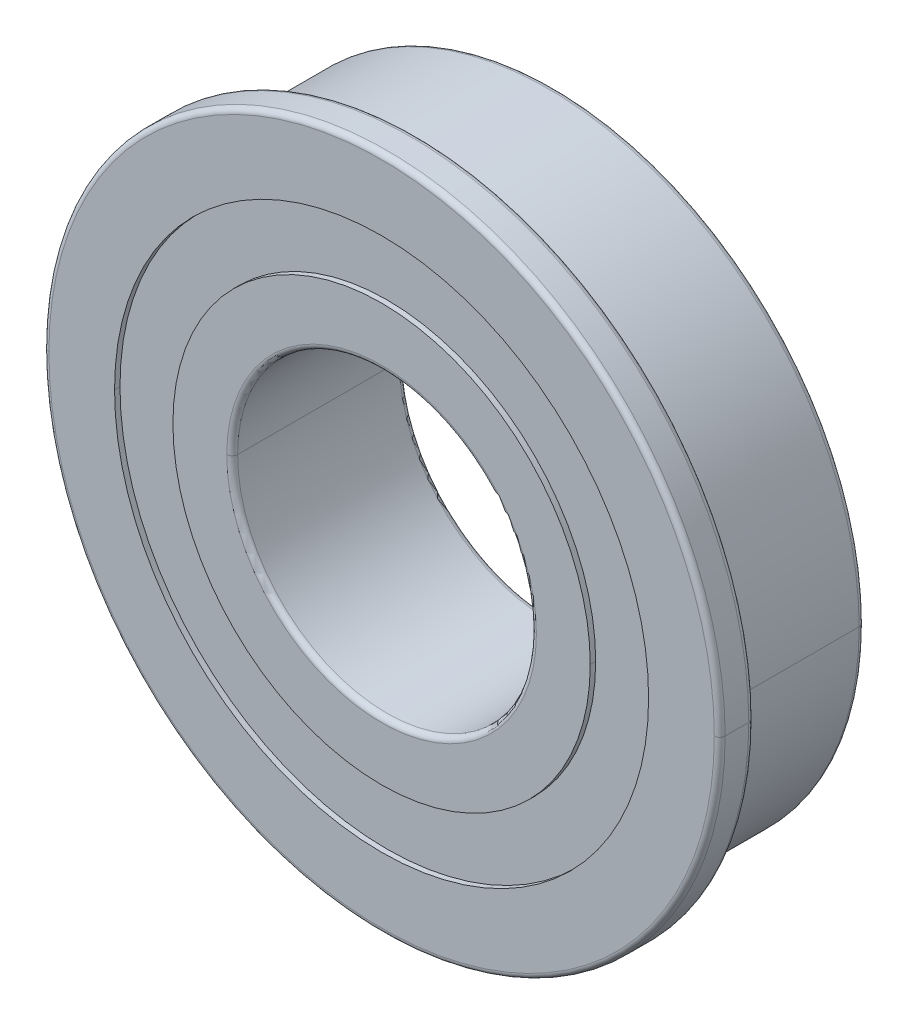
ISO-10303-21;
HEADER;
FILE_DESCRIPTION(('STEP AP214'),'2;1');
FILE_NAME('part.step','',(''),(''),'','','');
FILE_SCHEMA(('AUTOMOTIVE_DESIGN { 1 0 10303 214 1 1 1 1 }'));
ENDSEC;
DATA;
#1=APPLICATION_CONTEXT('core data for automotive mechanical design processes');
#2=APPLICATION_PROTOCOL_DEFINITION('international standard','automotive_design',2000,#1);
#3=PRODUCT_CONTEXT('',#1,'mechanical');
#4=PRODUCT('Part','Part','',(#3));
#5=PRODUCT_RELATED_PRODUCT_CATEGORY('part','',(#4));
#6=PRODUCT_DEFINITION_FORMATION('','',#4);
#7=PRODUCT_DEFINITION_CONTEXT('part definition',#1,'design');
#8=PRODUCT_DEFINITION('design','',#6,#7);
#9=PRODUCT_DEFINITION_SHAPE('','',#8);
#10=(LENGTH_UNIT() NAMED_UNIT(*) SI_UNIT(.MILLI.,.METRE.));
#11=(NAMED_UNIT(*) PLANE_ANGLE_UNIT() SI_UNIT($,.RADIAN.));
#12=(NAMED_UNIT(*) SI_UNIT($,.STERADIAN.) SOLID_ANGLE_UNIT());
#13=UNCERTAINTY_MEASURE_WITH_UNIT(LENGTH_MEASURE(1.E-05),#10,'distance_accuracy_value','');
#14=(GEOMETRIC_REPRESENTATION_CONTEXT(3) GLOBAL_UNCERTAINTY_ASSIGNED_CONTEXT((#13)) GLOBAL_UNIT_ASSIGNED_CONTEXT((#10,
#11,#12)) REPRESENTATION_CONTEXT('',''));
#15=CARTESIAN_POINT('',(0.,0.,0.));
#16=DIRECTION('',(0.,0.,1.));
#17=DIRECTION('',(1.,0.,0.));
#18=AXIS2_PLACEMENT_3D('',#15,#16,#17);
#19=CARTESIAN_POINT('',(0.,0.,3.71875));
#20=DIRECTION('',(0.,0.,-1.));
#21=DIRECTION('',(-1.,0.,0.));
#22=AXIS2_PLACEMENT_3D('',#19,#20,#21);
#23=TOROIDAL_SURFACE('',#22,15.31,0.25);
#24=CARTESIAN_POINT('',(15.31,0.,3.71875));
#25=DIRECTION('',(0.,1.,0.));
#26=DIRECTION('',(-1.,0.,0.));
#27=AXIS2_PLACEMENT_3D('',#24,#25,#26);
#28=CIRCLE('',#27,0.25);
#29=CARTESIAN_POINT('',(15.31,0.,3.96875));
#30=VERTEX_POINT('',#29);
#31=CARTESIAN_POINT('',(15.56,0.,3.71875));
#32=VERTEX_POINT('',#31);
#33=EDGE_CURVE('E414',#30,#32,#28,.T.);
#34=ORIENTED_EDGE('',*,*,#33,.F.);
#35=CARTESIAN_POINT('',(0.,0.,3.96875));
#36=DIRECTION('',(0.,0.,1.));
#37=DIRECTION('',(-1.,0.,0.));
#38=AXIS2_PLACEMENT_3D('',#35,#36,#37);
#39=CIRCLE('',#38,15.31);
#40=CARTESIAN_POINT('',(-15.31,0.,3.96875));
#41=VERTEX_POINT('',#40);
#42=EDGE_CURVE('E410',#41,#30,#39,.T.);
#43=ORIENTED_EDGE('',*,*,#42,.F.);
#44=CARTESIAN_POINT('',(-15.31,0.,3.71875));
#45=DIRECTION('',(0.,-1.,0.));
#46=DIRECTION('',(0.,0.,-1.));
#47=AXIS2_PLACEMENT_3D('',#44,#45,#46);
#48=CIRCLE('',#47,0.25);
#49=CARTESIAN_POINT('',(-15.56,0.,3.71875));
#50=VERTEX_POINT('',#49);
#51=EDGE_CURVE('E312',#41,#50,#48,.T.);
#52=ORIENTED_EDGE('',*,*,#51,.T.);
#53=CARTESIAN_POINT('',(0.,0.,3.71875));
#54=DIRECTION('',(0.,0.,-1.));
#55=DIRECTION('',(-1.,0.,0.));
#56=AXIS2_PLACEMENT_3D('',#53,#54,#55);
#57=CIRCLE('',#56,15.56);
#58=EDGE_CURVE('E419',#32,#50,#57,.T.);
#59=ORIENTED_EDGE('',*,*,#58,.F.);
#60=EDGE_LOOP('',(#34,#43,#52,#59));
#61=FACE_BOUND('',#60,.T.);
#62=ADVANCED_FACE('F16',(#61),#23,.T.);
#63=CARTESIAN_POINT('',(0.,0.,-3.71875));
#64=DIRECTION('',(0.,0.,1.));
#65=DIRECTION('',(1.,0.,0.));
#66=AXIS2_PLACEMENT_3D('',#63,#64,#65);
#67=TOROIDAL_SURFACE('',#66,14.0375,0.25);
#68=CARTESIAN_POINT('',(-14.0375,0.,-3.71875));
#69=DIRECTION('',(0.,1.,0.));
#70=DIRECTION('',(-1.,0.,0.));
#71=AXIS2_PLACEMENT_3D('',#68,#69,#70);
#72=CIRCLE('',#71,0.25);
#73=CARTESIAN_POINT('',(-14.0375,0.,-3.96875));
#74=VERTEX_POINT('',#73);
#75=CARTESIAN_POINT('',(-14.2875,0.,-3.71875));
#76=VERTEX_POINT('',#75);
#77=EDGE_CURVE('E321',#74,#76,#72,.T.);
#78=ORIENTED_EDGE('',*,*,#77,.F.);
#79=CARTESIAN_POINT('',(0.,0.,-3.96875));
#80=DIRECTION('',(0.,0.,-1.));
#81=DIRECTION('',(1.,0.,0.));
#82=AXIS2_PLACEMENT_3D('',#79,#80,#81);
#83=CIRCLE('',#82,14.0375);
#84=CARTESIAN_POINT('',(14.0375,0.,-3.96875));
#85=VERTEX_POINT('',#84);
#86=EDGE_CURVE('E456',#85,#74,#83,.T.);
#87=ORIENTED_EDGE('',*,*,#86,.F.);
#88=CARTESIAN_POINT('',(14.0375,0.,-3.71875));
#89=DIRECTION('',(0.,-1.,0.));
#90=DIRECTION('',(0.,0.,-1.));
#91=AXIS2_PLACEMENT_3D('',#88,#89,#90);
#92=CIRCLE('',#91,0.25);
#93=CARTESIAN_POINT('',(14.2875,0.,-3.71875));
#94=VERTEX_POINT('',#93);
#95=EDGE_CURVE('E334',#85,#94,#92,.T.);
#96=ORIENTED_EDGE('',*,*,#95,.T.);
#97=CARTESIAN_POINT('',(0.,0.,-3.71875));
#98=DIRECTION('',(0.,0.,1.));
#99=DIRECTION('',(1.,0.,0.));
#100=AXIS2_PLACEMENT_3D('',#97,#98,#99);
#101=CIRCLE('',#100,14.2875);
#102=EDGE_CURVE('E344',#76,#94,#101,.T.);
#103=ORIENTED_EDGE('',*,*,#102,.F.);
#104=EDGE_LOOP('',(#78,#87,#96,#103));
#105=FACE_BOUND('',#104,.T.);
#106=ADVANCED_FACE('F564',(#105),#67,.T.);
#107=CARTESIAN_POINT('',(0.,0.,2.63125));
#108=DIRECTION('',(0.,0.,1.));
#109=DIRECTION('',(1.,0.,0.));
#110=AXIS2_PLACEMENT_3D('',#107,#108,#109);
#111=TOROIDAL_SURFACE('',#110,15.31,0.25);
#112=CARTESIAN_POINT('',(-15.31,0.,2.63125));
#113=DIRECTION('',(0.,1.,0.));
#114=DIRECTION('',(-1.,0.,0.));
#115=AXIS2_PLACEMENT_3D('',#112,#113,#114);
#116=CIRCLE('',#115,0.25);
#117=CARTESIAN_POINT('',(-15.31,0.,2.38125));
#118=VERTEX_POINT('',#117);
#119=CARTESIAN_POINT('',(-15.56,0.,2.63125));
#120=VERTEX_POINT('',#119);
#121=EDGE_CURVE('E333',#118,#120,#116,.T.);
#122=ORIENTED_EDGE('',*,*,#121,.F.);
#123=CARTESIAN_POINT('',(0.,0.,2.38125));
#124=DIRECTION('',(0.,0.,-1.));
#125=DIRECTION('',(1.,0.,0.));
#126=AXIS2_PLACEMENT_3D('',#123,#124,#125);
#127=CIRCLE('',#126,15.31);
#128=CARTESIAN_POINT('',(15.31,0.,2.38125));
#129=VERTEX_POINT('',#128);
#130=EDGE_CURVE('E343',#129,#118,#127,.T.);
#131=ORIENTED_EDGE('',*,*,#130,.F.);
#132=CARTESIAN_POINT('',(15.31,0.,2.63125));
#133=DIRECTION('',(0.,-1.,0.));
#134=DIRECTION('',(0.,0.,-1.));
#135=AXIS2_PLACEMENT_3D('',#132,#133,#134);
#136=CIRCLE('',#135,0.25);
#137=CARTESIAN_POINT('',(15.56,0.,2.63125));
#138=VERTEX_POINT('',#137);
#139=EDGE_CURVE('E260',#129,#138,#136,.T.);
#140=ORIENTED_EDGE('',*,*,#139,.T.);
#141=CARTESIAN_POINT('',(0.,0.,2.63125));
#142=DIRECTION('',(0.,0.,1.));
#143=DIRECTION('',(1.,0.,0.));
#144=AXIS2_PLACEMENT_3D('',#141,#142,#143);
#145=CIRCLE('',#144,15.56);
#146=EDGE_CURVE('E367',#120,#138,#145,.T.);
#147=ORIENTED_EDGE('',*,*,#146,.F.);
#148=EDGE_LOOP('',(#122,#131,#140,#147));
#149=FACE_BOUND('',#148,.T.);
#150=ADVANCED_FACE('F385',(#149),#111,.T.);
#151=CARTESIAN_POINT('',(0.,0.,3.71875));
#152=DIRECTION('',(0.,0.,-1.));
#153=DIRECTION('',(-1.,0.,0.));
#154=AXIS2_PLACEMENT_3D('',#151,#152,#153);
#155=TOROIDAL_SURFACE('',#154,7.125,0.25);
#156=CARTESIAN_POINT('',(7.125,0.,3.71875));
#157=DIRECTION('',(0.,1.,0.));
#158=DIRECTION('',(-1.,0.,0.));
#159=AXIS2_PLACEMENT_3D('',#156,#157,#158);
#160=CIRCLE('',#159,0.25);
#161=CARTESIAN_POINT('',(6.875,0.,3.71875));
#162=VERTEX_POINT('',#161);
#163=CARTESIAN_POINT('',(7.125,0.,3.96875));
#164=VERTEX_POINT('',#163);
#165=EDGE_CURVE('E259',#162,#164,#160,.T.);
#166=ORIENTED_EDGE('',*,*,#165,.F.);
#167=CARTESIAN_POINT('',(0.,0.,3.71875));
#168=DIRECTION('',(0.,0.,1.));
#169=DIRECTION('',(-1.,0.,0.));
#170=AXIS2_PLACEMENT_3D('',#167,#168,#169);
#171=CIRCLE('',#170,6.875);
#172=CARTESIAN_POINT('',(-6.875,0.,3.71875));
#173=VERTEX_POINT('',#172);
#174=EDGE_CURVE('E288',#173,#162,#171,.T.);
#175=ORIENTED_EDGE('',*,*,#174,.F.);
#176=CARTESIAN_POINT('',(-7.125,0.,3.71875));
#177=DIRECTION('',(0.,-1.,0.));
#178=DIRECTION('',(0.,0.,-1.));
#179=AXIS2_PLACEMENT_3D('',#176,#177,#178);
#180=CIRCLE('',#179,0.25);
#181=CARTESIAN_POINT('',(-7.125,0.,3.96875));
#182=VERTEX_POINT('',#181);
#183=EDGE_CURVE('E436',#173,#182,#180,.T.);
#184=ORIENTED_EDGE('',*,*,#183,.T.);
#185=CARTESIAN_POINT('',(0.,0.,3.96875));
#186=DIRECTION('',(0.,0.,-1.));
#187=DIRECTION('',(-1.,0.,0.));
#188=AXIS2_PLACEMENT_3D('',#185,#186,#187);
#189=CIRCLE('',#188,7.125);
#190=EDGE_CURVE('E10',#164,#182,#189,.T.);
#191=ORIENTED_EDGE('',*,*,#190,.F.);
#192=EDGE_LOOP('',(#166,#175,#184,#191));
#193=FACE_BOUND('',#192,.T.);
#194=ADVANCED_FACE('F574',(#193),#155,.T.);
#195=CARTESIAN_POINT('',(0.,0.,-3.71875));
#196=DIRECTION('',(0.,0.,1.));
#197=DIRECTION('',(1.,0.,0.));
#198=AXIS2_PLACEMENT_3D('',#195,#196,#197);
#199=TOROIDAL_SURFACE('',#198,7.125,0.25);
#200=CARTESIAN_POINT('',(-7.125,0.,-3.71875));
#201=DIRECTION('',(0.,1.,0.));
#202=DIRECTION('',(-1.,0.,0.));
#203=AXIS2_PLACEMENT_3D('',#200,#201,#202);
#204=CIRCLE('',#203,0.25);
#205=CARTESIAN_POINT('',(-6.875,0.,-3.71875));
#206=VERTEX_POINT('',#205);
#207=CARTESIAN_POINT('',(-7.125,0.,-3.96875));
#208=VERTEX_POINT('',#207);
#209=EDGE_CURVE('E300',#206,#208,#204,.T.);
#210=ORIENTED_EDGE('',*,*,#209,.F.);
#211=CARTESIAN_POINT('',(0.,0.,-3.71875));
#212=DIRECTION('',(0.,0.,-1.));
#213=DIRECTION('',(1.,0.,0.));
#214=AXIS2_PLACEMENT_3D('',#211,#212,#213);
#215=CIRCLE('',#214,6.875);
#216=CARTESIAN_POINT('',(6.875,0.,-3.71875));
#217=VERTEX_POINT('',#216);
#218=EDGE_CURVE('E275',#217,#206,#215,.T.);
#219=ORIENTED_EDGE('',*,*,#218,.F.);
#220=CARTESIAN_POINT('',(7.125,0.,-3.71875));
#221=DIRECTION('',(0.,-1.,0.));
#222=DIRECTION('',(0.,0.,-1.));
#223=AXIS2_PLACEMENT_3D('',#220,#221,#222);
#224=CIRCLE('',#223,0.25);
#225=CARTESIAN_POINT('',(7.125,0.,-3.96875));
#226=VERTEX_POINT('',#225);
#227=EDGE_CURVE('E279',#217,#226,#224,.T.);
#228=ORIENTED_EDGE('',*,*,#227,.T.);
#229=CARTESIAN_POINT('',(0.,0.,-3.96875));
#230=DIRECTION('',(0.,0.,1.));
#231=DIRECTION('',(1.,0.,0.));
#232=AXIS2_PLACEMENT_3D('',#229,#230,#231);
#233=CIRCLE('',#232,7.125);
#234=EDGE_CURVE('E348',#208,#226,#233,.T.);
#235=ORIENTED_EDGE('',*,*,#234,.F.);
#236=EDGE_LOOP('',(#210,#219,#228,#235));
#237=FACE_BOUND('',#236,.T.);
#238=ADVANCED_FACE('F576',(#237),#199,.T.);
#239=CARTESIAN_POINT('',(0.,0.,53.2489151398072));
#240=DIRECTION('',(0.,0.,1.));
#241=DIRECTION('',(1.,0.,0.));
#242=AXIS2_PLACEMENT_3D('',#239,#240,#241);
#243=CYLINDRICAL_SURFACE('',#242,6.875);
#244=DIRECTION('',(0.,0.,1.));
#245=VECTOR('',#244,1.);
#246=CARTESIAN_POINT('',(-6.875,0.,53.2489151398072));
#247=LINE('',#246,#245);
#248=EDGE_CURVE('E278',#206,#173,#247,.T.);
#249=ORIENTED_EDGE('',*,*,#248,.F.);
#250=CARTESIAN_POINT('',(0.,0.,-3.71875));
#251=DIRECTION('',(0.,0.,-1.));
#252=DIRECTION('',(1.,0.,0.));
#253=AXIS2_PLACEMENT_3D('',#250,#251,#252);
#254=CIRCLE('',#253,6.875);
#255=EDGE_CURVE('E440',#206,#217,#254,.T.);
#256=ORIENTED_EDGE('',*,*,#255,.T.);
#257=DIRECTION('',(0.,0.,1.));
#258=VECTOR('',#257,1.);
#259=CARTESIAN_POINT('',(6.875,0.,53.2489151398072));
#260=LINE('',#259,#258);
#261=EDGE_CURVE('E470',#217,#162,#260,.T.);
#262=ORIENTED_EDGE('',*,*,#261,.T.);
#263=CARTESIAN_POINT('',(0.,0.,3.71875));
#264=DIRECTION('',(0.,0.,1.));
#265=DIRECTION('',(-1.,0.,0.));
#266=AXIS2_PLACEMENT_3D('',#263,#264,#265);
#267=CIRCLE('',#266,6.875);
#268=EDGE_CURVE('E255',#162,#173,#267,.T.);
#269=ORIENTED_EDGE('',*,*,#268,.T.);
#270=EDGE_LOOP('',(#249,#256,#262,#269));
#271=FACE_BOUND('',#270,.T.);
#272=ADVANCED_FACE('F582',(#271),#243,.F.);
#273=CARTESIAN_POINT('',(0.,9.602,3.96875));
#274=DIRECTION('',(0.,0.,-1.));
#275=DIRECTION('',(0.,-1.,0.));
#276=AXIS2_PLACEMENT_3D('',#273,#274,#275);
#277=PLANE('',#276);
#278=CARTESIAN_POINT('',(0.,0.,3.96875));
#279=DIRECTION('',(0.,0.,-1.));
#280=DIRECTION('',(-1.,0.,0.));
#281=AXIS2_PLACEMENT_3D('',#278,#279,#280);
#282=CIRCLE('',#281,7.125);
#283=EDGE_CURVE('E248',#182,#164,#282,.T.);
#284=ORIENTED_EDGE('',*,*,#283,.T.);
#285=ORIENTED_EDGE('',*,*,#190,.T.);
#286=EDGE_LOOP('',(#284,#285));
#287=FACE_BOUND('',#286,.T.);
#288=CARTESIAN_POINT('',(0.,0.,3.96875));
#289=DIRECTION('',(0.,0.,1.));
#290=DIRECTION('',(1.,0.,0.));
#291=AXIS2_PLACEMENT_3D('',#288,#289,#290);
#292=CIRCLE('',#291,9.602);
#293=CARTESIAN_POINT('',(9.602,0.,3.96875));
#294=VERTEX_POINT('',#293);
#295=CARTESIAN_POINT('',(-9.602,0.,3.96875));
#296=VERTEX_POINT('',#295);
#297=EDGE_CURVE('E311',#294,#296,#292,.T.);
#298=ORIENTED_EDGE('',*,*,#297,.T.);
#299=CARTESIAN_POINT('',(0.,0.,3.96875));
#300=DIRECTION('',(0.,0.,1.));
#301=DIRECTION('',(1.,0.,0.));
#302=AXIS2_PLACEMENT_3D('',#299,#300,#301);
#303=CIRCLE('',#302,9.602);
#304=EDGE_CURVE('E27',#296,#294,#303,.T.);
#305=ORIENTED_EDGE('',*,*,#304,.T.);
#306=EDGE_LOOP('',(#298,#305));
#307=FACE_BOUND('',#306,.T.);
#308=ADVANCED_FACE('F847',(#287,#307),#277,.F.);
#309=CARTESIAN_POINT('',(0.,0.,53.2489151398072));
#310=DIRECTION('',(0.,0.,1.));
#311=DIRECTION('',(1.,0.,0.));
#312=AXIS2_PLACEMENT_3D('',#309,#310,#311);
#313=CYLINDRICAL_SURFACE('',#312,9.602);
#314=DIRECTION('',(0.,0.,1.));
#315=VECTOR('',#314,1.);
#316=CARTESIAN_POINT('',(-9.602,0.,53.2489151398072));
#317=LINE('',#316,#315);
#318=CARTESIAN_POINT('',(-9.602,0.,3.71875));
#319=VERTEX_POINT('',#318);
#320=EDGE_CURVE('E449',#319,#296,#317,.T.);
#321=ORIENTED_EDGE('',*,*,#320,.F.);
#322=CARTESIAN_POINT('',(0.,0.,3.71875));
#323=DIRECTION('',(0.,0.,1.));
#324=DIRECTION('',(1.,0.,0.));
#325=AXIS2_PLACEMENT_3D('',#322,#323,#324);
#326=CIRCLE('',#325,9.602);
#327=CARTESIAN_POINT('',(9.602,0.,3.71875));
#328=VERTEX_POINT('',#327);
#329=EDGE_CURVE('E327',#319,#328,#326,.T.);
#330=ORIENTED_EDGE('',*,*,#329,.T.);
#331=DIRECTION('',(0.,0.,1.));
#332=VECTOR('',#331,1.);
#333=CARTESIAN_POINT('',(9.602,0.,53.2489151398072));
#334=LINE('',#333,#332);
#335=EDGE_CURVE('E306',#328,#294,#334,.T.);
#336=ORIENTED_EDGE('',*,*,#335,.T.);
#337=ORIENTED_EDGE('',*,*,#304,.F.);
#338=EDGE_LOOP('',(#321,#330,#336,#337));
#339=FACE_BOUND('',#338,.T.);
#340=ADVANCED_FACE('F842',(#339),#313,.T.);
#341=CARTESIAN_POINT('',(0.,12.2875,3.71875));
#342=DIRECTION('',(0.,0.,-1.));
#343=DIRECTION('',(0.,-1.,0.));
#344=AXIS2_PLACEMENT_3D('',#341,#342,#343);
#345=PLANE('',#344);
#346=CARTESIAN_POINT('',(0.,0.,3.71875));
#347=DIRECTION('',(0.,0.,1.));
#348=DIRECTION('',(1.,0.,0.));
#349=AXIS2_PLACEMENT_3D('',#346,#347,#348);
#350=CIRCLE('',#349,9.602);
#351=EDGE_CURVE('E453',#328,#319,#350,.T.);
#352=ORIENTED_EDGE('',*,*,#351,.F.);
#353=ORIENTED_EDGE('',*,*,#329,.F.);
#354=EDGE_LOOP('',(#352,#353));
#355=FACE_BOUND('',#354,.T.);
#356=CARTESIAN_POINT('',(0.,0.,3.71875));
#357=DIRECTION('',(0.,0.,1.));
#358=DIRECTION('',(1.,0.,0.));
#359=AXIS2_PLACEMENT_3D('',#356,#357,#358);
#360=CIRCLE('',#359,12.2875);
#361=CARTESIAN_POINT('',(12.2875,0.,3.71875));
#362=VERTEX_POINT('',#361);
#363=CARTESIAN_POINT('',(-12.2875,0.,3.71875));
#364=VERTEX_POINT('',#363);
#365=EDGE_CURVE('E324',#362,#364,#360,.T.);
#366=ORIENTED_EDGE('',*,*,#365,.T.);
#367=CARTESIAN_POINT('',(0.,0.,3.71875));
#368=DIRECTION('',(0.,0.,1.));
#369=DIRECTION('',(1.,0.,0.));
#370=AXIS2_PLACEMENT_3D('',#367,#368,#369);
#371=CIRCLE('',#370,12.2875);
#372=EDGE_CURVE('E310',#364,#362,#371,.T.);
#373=ORIENTED_EDGE('',*,*,#372,.T.);
#374=EDGE_LOOP('',(#366,#373));
#375=FACE_BOUND('',#374,.T.);
#376=ADVANCED_FACE('F846',(#355,#375),#345,.F.);
#377=CARTESIAN_POINT('',(0.,0.,53.2489151398072));
#378=DIRECTION('',(0.,0.,1.));
#379=DIRECTION('',(1.,0.,0.));
#380=AXIS2_PLACEMENT_3D('',#377,#378,#379);
#381=CYLINDRICAL_SURFACE('',#380,12.2875);
#382=DIRECTION('',(0.,0.,1.));
#383=VECTOR('',#382,1.);
#384=CARTESIAN_POINT('',(-12.2875,0.,53.2489151398072));
#385=LINE('',#384,#383);
#386=CARTESIAN_POINT('',(-12.2875,0.,3.96875));
#387=VERTEX_POINT('',#386);
#388=EDGE_CURVE('E355',#364,#387,#385,.T.);
#389=ORIENTED_EDGE('',*,*,#388,.F.);
#390=ORIENTED_EDGE('',*,*,#365,.F.);
#391=DIRECTION('',(0.,0.,1.));
#392=VECTOR('',#391,1.);
#393=CARTESIAN_POINT('',(12.2875,0.,53.2489151398072));
#394=LINE('',#393,#392);
#395=CARTESIAN_POINT('',(12.2875,0.,3.96875));
#396=VERTEX_POINT('',#395);
#397=EDGE_CURVE('E304',#362,#396,#394,.T.);
#398=ORIENTED_EDGE('',*,*,#397,.T.);
#399=CARTESIAN_POINT('',(0.,0.,3.96875));
#400=DIRECTION('',(0.,0.,1.));
#401=DIRECTION('',(1.,0.,0.));
#402=AXIS2_PLACEMENT_3D('',#399,#400,#401);
#403=CIRCLE('',#402,12.2875);
#404=EDGE_CURVE('E328',#396,#387,#403,.T.);
#405=ORIENTED_EDGE('',*,*,#404,.T.);
#406=EDGE_LOOP('',(#389,#390,#398,#405));
#407=FACE_BOUND('',#406,.T.);
#408=ADVANCED_FACE('F524',(#407),#381,.F.);
#409=CARTESIAN_POINT('',(0.,15.56,3.96875));
#410=DIRECTION('',(0.,0.,-1.));
#411=DIRECTION('',(0.,-1.,0.));
#412=AXIS2_PLACEMENT_3D('',#409,#410,#411);
#413=PLANE('',#412);
#414=ORIENTED_EDGE('',*,*,#404,.F.);
#415=CARTESIAN_POINT('',(0.,0.,3.96875));
#416=DIRECTION('',(0.,0.,1.));
#417=DIRECTION('',(1.,0.,0.));
#418=AXIS2_PLACEMENT_3D('',#415,#416,#417);
#419=CIRCLE('',#418,12.2875);
#420=EDGE_CURVE('E359',#387,#396,#419,.T.);
#421=ORIENTED_EDGE('',*,*,#420,.F.);
#422=EDGE_LOOP('',(#414,#421));
#423=FACE_BOUND('',#422,.T.);
#424=ORIENTED_EDGE('',*,*,#42,.T.);
#425=CARTESIAN_POINT('',(0.,0.,3.96875));
#426=DIRECTION('',(0.,0.,1.));
#427=DIRECTION('',(-1.,0.,0.));
#428=AXIS2_PLACEMENT_3D('',#425,#426,#427);
#429=CIRCLE('',#428,15.31);
#430=EDGE_CURVE('E269',#30,#41,#429,.T.);
#431=ORIENTED_EDGE('',*,*,#430,.T.);
#432=EDGE_LOOP('',(#424,#431));
#433=FACE_BOUND('',#432,.T.);
#434=ADVANCED_FACE('F423',(#423,#433),#413,.F.);
#435=CARTESIAN_POINT('',(0.,0.,53.2489151398072));
#436=DIRECTION('',(0.,0.,1.));
#437=DIRECTION('',(1.,0.,0.));
#438=AXIS2_PLACEMENT_3D('',#435,#436,#437);
#439=CYLINDRICAL_SURFACE('',#438,15.56);
#440=DIRECTION('',(0.,0.,1.));
#441=VECTOR('',#440,1.);
#442=CARTESIAN_POINT('',(-15.56,0.,53.2489151398072));
#443=LINE('',#442,#441);
#444=EDGE_CURVE('E244',#120,#50,#443,.T.);
#445=ORIENTED_EDGE('',*,*,#444,.F.);
#446=ORIENTED_EDGE('',*,*,#146,.T.);
#447=DIRECTION('',(0.,0.,1.));
#448=VECTOR('',#447,1.);
#449=CARTESIAN_POINT('',(15.56,0.,53.2489151398072));
#450=LINE('',#449,#448);
#451=EDGE_CURVE('E237',#138,#32,#450,.T.);
#452=ORIENTED_EDGE('',*,*,#451,.T.);
#453=ORIENTED_EDGE('',*,*,#58,.T.);
#454=EDGE_LOOP('',(#445,#446,#452,#453));
#455=FACE_BOUND('',#454,.T.);
#456=ADVANCED_FACE('F481',(#455),#439,.T.);
#457=CARTESIAN_POINT('',(0.,14.2875,2.38125));
#458=DIRECTION('',(0.,0.,1.));
#459=DIRECTION('',(1.,0.,0.));
#460=AXIS2_PLACEMENT_3D('',#457,#458,#459);
#461=PLANE('',#460);
#462=CARTESIAN_POINT('',(0.,0.,2.38125));
#463=DIRECTION('',(0.,0.,1.));
#464=DIRECTION('',(1.,0.,0.));
#465=AXIS2_PLACEMENT_3D('',#462,#463,#464);
#466=CIRCLE('',#465,14.2875);
#467=CARTESIAN_POINT('',(14.2875,0.,2.38125));
#468=VERTEX_POINT('',#467);
#469=CARTESIAN_POINT('',(-14.2875,0.,2.38125));
#470=VERTEX_POINT('',#469);
#471=EDGE_CURVE('E264',#468,#470,#466,.T.);
#472=ORIENTED_EDGE('',*,*,#471,.T.);
#473=CARTESIAN_POINT('',(0.,0.,2.38125));
#474=DIRECTION('',(0.,0.,1.));
#475=DIRECTION('',(1.,0.,0.));
#476=AXIS2_PLACEMENT_3D('',#473,#474,#475);
#477=CIRCLE('',#476,14.2875);
#478=EDGE_CURVE('E265',#470,#468,#477,.T.);
#479=ORIENTED_EDGE('',*,*,#478,.T.);
#480=EDGE_LOOP('',(#472,#479));
#481=FACE_BOUND('',#480,.T.);
#482=ORIENTED_EDGE('',*,*,#130,.T.);
#483=CARTESIAN_POINT('',(0.,0.,2.38125));
#484=DIRECTION('',(0.,0.,-1.));
#485=DIRECTION('',(1.,0.,0.));
#486=AXIS2_PLACEMENT_3D('',#483,#484,#485);
#487=CIRCLE('',#486,15.31);
#488=EDGE_CURVE('E329',#118,#129,#487,.T.);
#489=ORIENTED_EDGE('',*,*,#488,.T.);
#490=EDGE_LOOP('',(#482,#489));
#491=FACE_BOUND('',#490,.T.);
#492=ADVANCED_FACE('F878',(#481,#491),#461,.F.);
#493=CARTESIAN_POINT('',(0.,0.,2.13125));
#494=DIRECTION('',(0.,0.,1.));
#495=DIRECTION('',(1.,0.,0.));
#496=AXIS2_PLACEMENT_3D('',#493,#494,#495);
#497=TOROIDAL_SURFACE('',#496,14.2875,0.25);
#498=CARTESIAN_POINT('',(0.,0.,2.13125));
#499=DIRECTION('',(0.,0.,1.));
#500=DIRECTION('',(1.,0.,0.));
#501=AXIS2_PLACEMENT_3D('',#498,#499,#500);
#502=CIRCLE('',#501,14.0375);
#503=CARTESIAN_POINT('',(14.0375,0.,2.13125));
#504=VERTEX_POINT('',#503);
#505=CARTESIAN_POINT('',(-14.0375,0.,2.13125));
#506=VERTEX_POINT('',#505);
#507=EDGE_CURVE('E254',#504,#506,#502,.T.);
#508=ORIENTED_EDGE('',*,*,#507,.F.);
#509=CARTESIAN_POINT('',(14.2875,0.,2.13125));
#510=DIRECTION('',(0.,-1.,0.));
#511=DIRECTION('',(0.,0.,-1.));
#512=AXIS2_PLACEMENT_3D('',#509,#510,#511);
#513=CIRCLE('',#512,0.25);
#514=CARTESIAN_POINT('',(14.0709936490539,0.,2.00625));
#515=VERTEX_POINT('',#514);
#516=EDGE_CURVE('E222',#504,#515,#513,.T.);
#517=ORIENTED_EDGE('',*,*,#516,.T.);
#518=CARTESIAN_POINT('',(0.,0.,2.00625));
#519=DIRECTION('',(0.,0.,1.));
#520=DIRECTION('',(1.,0.,0.));
#521=AXIS2_PLACEMENT_3D('',#518,#519,#520);
#522=CIRCLE('',#521,14.0709936490539);
#523=CARTESIAN_POINT('',(-14.0709936490539,0.,2.00625));
#524=VERTEX_POINT('',#523);
#525=EDGE_CURVE('E207',#515,#524,#522,.T.);
#526=ORIENTED_EDGE('',*,*,#525,.T.);
#527=CARTESIAN_POINT('',(-14.2875,0.,2.13125));
#528=DIRECTION('',(0.,1.,0.));
#529=DIRECTION('',(-1.,0.,0.));
#530=AXIS2_PLACEMENT_3D('',#527,#528,#529);
#531=CIRCLE('',#530,0.25);
#532=EDGE_CURVE('E220',#506,#524,#531,.T.);
#533=ORIENTED_EDGE('',*,*,#532,.F.);
#534=EDGE_LOOP('',(#508,#517,#526,#533));
#535=FACE_BOUND('',#534,.T.);
#536=ADVANCED_FACE('F218',(#535),#497,.F.);
#537=CARTESIAN_POINT('',(0.,0.,1.63125));
#538=DIRECTION('',(0.,0.,-1.));
#539=DIRECTION('',(-1.,0.,0.));
#540=AXIS2_PLACEMENT_3D('',#537,#538,#539);
#541=CONICAL_SURFACE('',#540,14.2875,0.523598775598298);
#542=DIRECTION('',(0.5,0.,-0.86602540378444));
#543=VECTOR('',#542,1.);
#544=CARTESIAN_POINT('',(14.2875,0.,1.63125));
#545=LINE('',#544,#543);
#546=CARTESIAN_POINT('',(14.2875,0.,1.63125));
#547=VERTEX_POINT('',#546);
#548=EDGE_CURVE('E225',#515,#547,#545,.T.);
#549=ORIENTED_EDGE('',*,*,#548,.F.);
#550=CARTESIAN_POINT('',(0.,0.,2.00625));
#551=DIRECTION('',(0.,0.,1.));
#552=DIRECTION('',(1.,0.,0.));
#553=AXIS2_PLACEMENT_3D('',#550,#551,#552);
#554=CIRCLE('',#553,14.0709936490539);
#555=EDGE_CURVE('E227',#524,#515,#554,.T.);
#556=ORIENTED_EDGE('',*,*,#555,.F.);
#557=DIRECTION('',(-0.5,0.,-0.86602540378444));
#558=VECTOR('',#557,1.);
#559=CARTESIAN_POINT('',(-14.2875,0.,1.63125));
#560=LINE('',#559,#558);
#561=CARTESIAN_POINT('',(-14.2875,0.,1.63125));
#562=VERTEX_POINT('',#561);
#563=EDGE_CURVE('E203',#524,#562,#560,.T.);
#564=ORIENTED_EDGE('',*,*,#563,.T.);
#565=CARTESIAN_POINT('',(0.,0.,1.63125));
#566=DIRECTION('',(0.,0.,1.));
#567=DIRECTION('',(1.,0.,0.));
#568=AXIS2_PLACEMENT_3D('',#565,#566,#567);
#569=CIRCLE('',#568,14.2875);
#570=EDGE_CURVE('E340',#562,#547,#569,.T.);
#571=ORIENTED_EDGE('',*,*,#570,.T.);
#572=EDGE_LOOP('',(#549,#556,#564,#571));
#573=FACE_BOUND('',#572,.T.);
#574=ADVANCED_FACE('F228',(#573),#541,.T.);
#575=CARTESIAN_POINT('',(0.,0.,53.2489151398072));
#576=DIRECTION('',(0.,0.,1.));
#577=DIRECTION('',(1.,0.,0.));
#578=AXIS2_PLACEMENT_3D('',#575,#576,#577);
#579=CYLINDRICAL_SURFACE('',#578,14.2875);
#580=DIRECTION('',(0.,0.,1.));
#581=VECTOR('',#580,1.);
#582=CARTESIAN_POINT('',(-14.2875,0.,53.2489151398072));
#583=LINE('',#582,#581);
#584=EDGE_CURVE('E214',#76,#562,#583,.T.);
#585=ORIENTED_EDGE('',*,*,#584,.F.);
#586=ORIENTED_EDGE('',*,*,#102,.T.);
#587=DIRECTION('',(0.,0.,1.));
#588=VECTOR('',#587,1.);
#589=CARTESIAN_POINT('',(14.2875,0.,53.2489151398072));
#590=LINE('',#589,#588);
#591=EDGE_CURVE('E20',#94,#547,#590,.T.);
#592=ORIENTED_EDGE('',*,*,#591,.T.);
#593=ORIENTED_EDGE('',*,*,#570,.F.);
#594=EDGE_LOOP('',(#585,#586,#592,#593));
#595=FACE_BOUND('',#594,.T.);
#596=ADVANCED_FACE('F890',(#595),#579,.T.);
#597=CARTESIAN_POINT('',(0.,12.2875,-3.96875));
#598=DIRECTION('',(0.,0.,1.));
#599=DIRECTION('',(1.,0.,0.));
#600=AXIS2_PLACEMENT_3D('',#597,#598,#599);
#601=PLANE('',#600);
#602=CARTESIAN_POINT('',(0.,0.,-3.96875));
#603=DIRECTION('',(0.,0.,1.));
#604=DIRECTION('',(1.,0.,0.));
#605=AXIS2_PLACEMENT_3D('',#602,#603,#604);
#606=CIRCLE('',#605,12.2875);
#607=CARTESIAN_POINT('',(12.2875,0.,-3.96875));
#608=VERTEX_POINT('',#607);
#609=CARTESIAN_POINT('',(-12.2875,0.,-3.96875));
#610=VERTEX_POINT('',#609);
#611=EDGE_CURVE('E339',#608,#610,#606,.T.);
#612=ORIENTED_EDGE('',*,*,#611,.T.);
#613=CARTESIAN_POINT('',(0.,0.,-3.96875));
#614=DIRECTION('',(0.,0.,1.));
#615=DIRECTION('',(1.,0.,0.));
#616=AXIS2_PLACEMENT_3D('',#613,#614,#615);
#617=CIRCLE('',#616,12.2875);
#618=EDGE_CURVE('E463',#610,#608,#617,.T.);
#619=ORIENTED_EDGE('',*,*,#618,.T.);
#620=EDGE_LOOP('',(#612,#619));
#621=FACE_BOUND('',#620,.T.);
#622=ORIENTED_EDGE('',*,*,#86,.T.);
#623=CARTESIAN_POINT('',(0.,0.,-3.96875));
#624=DIRECTION('',(0.,0.,-1.));
#625=DIRECTION('',(1.,0.,0.));
#626=AXIS2_PLACEMENT_3D('',#623,#624,#625);
#627=CIRCLE('',#626,14.0375);
#628=EDGE_CURVE('E316',#74,#85,#627,.T.);
#629=ORIENTED_EDGE('',*,*,#628,.T.);
#630=EDGE_LOOP('',(#622,#629));
#631=FACE_BOUND('',#630,.T.);
#632=ADVANCED_FACE('F885',(#621,#631),#601,.F.);
#633=CARTESIAN_POINT('',(0.,0.,53.2489151398072));
#634=DIRECTION('',(0.,0.,1.));
#635=DIRECTION('',(1.,0.,0.));
#636=AXIS2_PLACEMENT_3D('',#633,#634,#635);
#637=CYLINDRICAL_SURFACE('',#636,12.2875);
#638=DIRECTION('',(0.,0.,1.));
#639=VECTOR('',#638,1.);
#640=CARTESIAN_POINT('',(-12.2875,0.,53.2489151398072));
#641=LINE('',#640,#639);
#642=CARTESIAN_POINT('',(-12.2875,0.,-3.71875));
#643=VERTEX_POINT('',#642);
#644=EDGE_CURVE('E274',#610,#643,#641,.T.);
#645=ORIENTED_EDGE('',*,*,#644,.F.);
#646=ORIENTED_EDGE('',*,*,#611,.F.);
#647=DIRECTION('',(0.,0.,1.));
#648=VECTOR('',#647,1.);
#649=CARTESIAN_POINT('',(12.2875,0.,53.2489151398072));
#650=LINE('',#649,#648);
#651=CARTESIAN_POINT('',(12.2875,0.,-3.71875));
#652=VERTEX_POINT('',#651);
#653=EDGE_CURVE('E273',#608,#652,#650,.T.);
#654=ORIENTED_EDGE('',*,*,#653,.T.);
#655=CARTESIAN_POINT('',(0.,0.,-3.71875));
#656=DIRECTION('',(0.,0.,1.));
#657=DIRECTION('',(1.,0.,0.));
#658=AXIS2_PLACEMENT_3D('',#655,#656,#657);
#659=CIRCLE('',#658,12.2875);
#660=EDGE_CURVE('E335',#652,#643,#659,.T.);
#661=ORIENTED_EDGE('',*,*,#660,.T.);
#662=EDGE_LOOP('',(#645,#646,#654,#661));
#663=FACE_BOUND('',#662,.T.);
#664=ADVANCED_FACE('F889',(#663),#637,.F.);
#665=CARTESIAN_POINT('',(0.,9.602,-3.71875));
#666=DIRECTION('',(0.,0.,1.));
#667=DIRECTION('',(1.,0.,0.));
#668=AXIS2_PLACEMENT_3D('',#665,#666,#667);
#669=PLANE('',#668);
#670=CARTESIAN_POINT('',(0.,0.,-3.71875));
#671=DIRECTION('',(0.,0.,1.));
#672=DIRECTION('',(1.,0.,0.));
#673=AXIS2_PLACEMENT_3D('',#670,#671,#672);
#674=CIRCLE('',#673,9.602);
#675=CARTESIAN_POINT('',(9.602,0.,-3.71875));
#676=VERTEX_POINT('',#675);
#677=CARTESIAN_POINT('',(-9.602,0.,-3.71875));
#678=VERTEX_POINT('',#677);
#679=EDGE_CURVE('E352',#676,#678,#674,.T.);
#680=ORIENTED_EDGE('',*,*,#679,.T.);
#681=CARTESIAN_POINT('',(0.,0.,-3.71875));
#682=DIRECTION('',(0.,0.,1.));
#683=DIRECTION('',(1.,0.,0.));
#684=AXIS2_PLACEMENT_3D('',#681,#682,#683);
#685=CIRCLE('',#684,9.602);
#686=EDGE_CURVE('E41',#678,#676,#685,.T.);
#687=ORIENTED_EDGE('',*,*,#686,.T.);
#688=EDGE_LOOP('',(#680,#687));
#689=FACE_BOUND('',#688,.T.);
#690=ORIENTED_EDGE('',*,*,#660,.F.);
#691=CARTESIAN_POINT('',(0.,0.,-3.71875));
#692=DIRECTION('',(0.,0.,1.));
#693=DIRECTION('',(1.,0.,0.));
#694=AXIS2_PLACEMENT_3D('',#691,#692,#693);
#695=CIRCLE('',#694,12.2875);
#696=EDGE_CURVE('E270',#643,#652,#695,.T.);
#697=ORIENTED_EDGE('',*,*,#696,.F.);
#698=EDGE_LOOP('',(#690,#697));
#699=FACE_BOUND('',#698,.T.);
#700=ADVANCED_FACE('F541',(#689,#699),#669,.F.);
#701=CARTESIAN_POINT('',(0.,0.,53.2489151398072));
#702=DIRECTION('',(0.,0.,1.));
#703=DIRECTION('',(1.,0.,0.));
#704=AXIS2_PLACEMENT_3D('',#701,#702,#703);
#705=CYLINDRICAL_SURFACE('',#704,9.602);
#706=DIRECTION('',(0.,0.,1.));
#707=VECTOR('',#706,1.);
#708=CARTESIAN_POINT('',(-9.602,0.,53.2489151398072));
#709=LINE('',#708,#707);
#710=CARTESIAN_POINT('',(-9.602,0.,-3.96875));
#711=VERTEX_POINT('',#710);
#712=EDGE_CURVE('E364',#711,#678,#709,.T.);
#713=ORIENTED_EDGE('',*,*,#712,.F.);
#714=CARTESIAN_POINT('',(0.,0.,-3.96875));
#715=DIRECTION('',(0.,0.,1.));
#716=DIRECTION('',(1.,0.,0.));
#717=AXIS2_PLACEMENT_3D('',#714,#715,#716);
#718=CIRCLE('',#717,9.602);
#719=CARTESIAN_POINT('',(9.602,0.,-3.96875));
#720=VERTEX_POINT('',#719);
#721=EDGE_CURVE('E345',#711,#720,#718,.T.);
#722=ORIENTED_EDGE('',*,*,#721,.T.);
#723=DIRECTION('',(0.,0.,1.));
#724=VECTOR('',#723,1.);
#725=CARTESIAN_POINT('',(9.602,0.,53.2489151398072));
#726=LINE('',#725,#724);
#727=EDGE_CURVE('E349',#720,#676,#726,.T.);
#728=ORIENTED_EDGE('',*,*,#727,.T.);
#729=ORIENTED_EDGE('',*,*,#686,.F.);
#730=EDGE_LOOP('',(#713,#722,#728,#729));
#731=FACE_BOUND('',#730,.T.);
#732=ADVANCED_FACE('F18',(#731),#705,.T.);
#733=CARTESIAN_POINT('',(0.,6.875,-3.96875));
#734=DIRECTION('',(0.,0.,1.));
#735=DIRECTION('',(1.,0.,0.));
#736=AXIS2_PLACEMENT_3D('',#733,#734,#735);
#737=PLANE('',#736);
#738=CARTESIAN_POINT('',(0.,0.,-3.96875));
#739=DIRECTION('',(0.,0.,1.));
#740=DIRECTION('',(1.,0.,0.));
#741=AXIS2_PLACEMENT_3D('',#738,#739,#740);
#742=CIRCLE('',#741,7.125);
#743=EDGE_CURVE('E291',#226,#208,#742,.T.);
#744=ORIENTED_EDGE('',*,*,#743,.T.);
#745=ORIENTED_EDGE('',*,*,#234,.T.);
#746=EDGE_LOOP('',(#744,#745));
#747=FACE_BOUND('',#746,.T.);
#748=CARTESIAN_POINT('',(0.,0.,-3.96875));
#749=DIRECTION('',(0.,0.,1.));
#750=DIRECTION('',(1.,0.,0.));
#751=AXIS2_PLACEMENT_3D('',#748,#749,#750);
#752=CIRCLE('',#751,9.602);
#753=EDGE_CURVE('E360',#720,#711,#752,.T.);
#754=ORIENTED_EDGE('',*,*,#753,.F.);
#755=ORIENTED_EDGE('',*,*,#721,.F.);
#756=EDGE_LOOP('',(#754,#755));
#757=FACE_BOUND('',#756,.T.);
#758=ADVANCED_FACE('F550',(#747,#757),#737,.F.);
#759=CARTESIAN_POINT('',(0.,0.,53.2489151398072));
#760=DIRECTION('',(0.,0.,1.));
#761=DIRECTION('',(1.,0.,0.));
#762=AXIS2_PLACEMENT_3D('',#759,#760,#761);
#763=CYLINDRICAL_SURFACE('',#762,9.602);
#764=ORIENTED_EDGE('',*,*,#753,.T.);
#765=ORIENTED_EDGE('',*,*,#712,.T.);
#766=ORIENTED_EDGE('',*,*,#679,.F.);
#767=ORIENTED_EDGE('',*,*,#727,.F.);
#768=EDGE_LOOP('',(#764,#765,#766,#767));
#769=FACE_BOUND('',#768,.T.);
#770=ADVANCED_FACE('F546',(#769),#763,.T.);
#771=CARTESIAN_POINT('',(0.,0.,53.2489151398072));
#772=DIRECTION('',(0.,0.,1.));
#773=DIRECTION('',(1.,0.,0.));
#774=AXIS2_PLACEMENT_3D('',#771,#772,#773);
#775=CYLINDRICAL_SURFACE('',#774,12.2875);
#776=ORIENTED_EDGE('',*,*,#618,.F.);
#777=ORIENTED_EDGE('',*,*,#644,.T.);
#778=ORIENTED_EDGE('',*,*,#696,.T.);
#779=ORIENTED_EDGE('',*,*,#653,.F.);
#780=EDGE_LOOP('',(#776,#777,#778,#779));
#781=FACE_BOUND('',#780,.T.);
#782=ADVANCED_FACE('F559',(#781),#775,.F.);
#783=CARTESIAN_POINT('',(0.,0.,53.2489151398072));
#784=DIRECTION('',(0.,0.,1.));
#785=DIRECTION('',(1.,0.,0.));
#786=AXIS2_PLACEMENT_3D('',#783,#784,#785);
#787=CYLINDRICAL_SURFACE('',#786,14.2875);
#788=CARTESIAN_POINT('',(0.,0.,-3.71875));
#789=DIRECTION('',(0.,0.,1.));
#790=DIRECTION('',(1.,0.,0.));
#791=AXIS2_PLACEMENT_3D('',#788,#789,#790);
#792=CIRCLE('',#791,14.2875);
#793=EDGE_CURVE('E372',#94,#76,#792,.T.);
#794=ORIENTED_EDGE('',*,*,#793,.T.);
#795=ORIENTED_EDGE('',*,*,#584,.T.);
#796=CARTESIAN_POINT('',(0.,0.,1.63125));
#797=DIRECTION('',(0.,0.,1.));
#798=DIRECTION('',(1.,0.,0.));
#799=AXIS2_PLACEMENT_3D('',#796,#797,#798);
#800=CIRCLE('',#799,14.2875);
#801=EDGE_CURVE('E210',#547,#562,#800,.T.);
#802=ORIENTED_EDGE('',*,*,#801,.F.);
#803=ORIENTED_EDGE('',*,*,#591,.F.);
#804=EDGE_LOOP('',(#794,#795,#802,#803));
#805=FACE_BOUND('',#804,.T.);
#806=ADVANCED_FACE('F834',(#805),#787,.T.);
#807=CARTESIAN_POINT('',(0.,0.,1.63125));
#808=DIRECTION('',(0.,0.,-1.));
#809=DIRECTION('',(-1.,0.,0.));
#810=AXIS2_PLACEMENT_3D('',#807,#808,#809);
#811=CONICAL_SURFACE('',#810,14.2875,0.523598775598298);
#812=ORIENTED_EDGE('',*,*,#525,.F.);
#813=ORIENTED_EDGE('',*,*,#548,.T.);
#814=ORIENTED_EDGE('',*,*,#801,.T.);
#815=ORIENTED_EDGE('',*,*,#563,.F.);
#816=EDGE_LOOP('',(#812,#813,#814,#815));
#817=FACE_BOUND('',#816,.T.);
#818=ADVANCED_FACE('F205',(#817),#811,.T.);
#819=CARTESIAN_POINT('',(0.,0.,2.13125));
#820=DIRECTION('',(0.,0.,1.));
#821=DIRECTION('',(1.,0.,0.));
#822=AXIS2_PLACEMENT_3D('',#819,#820,#821);
#823=TOROIDAL_SURFACE('',#822,14.2875,0.25);
#824=CARTESIAN_POINT('',(0.,0.,2.13125));
#825=DIRECTION('',(0.,0.,1.));
#826=DIRECTION('',(1.,0.,0.));
#827=AXIS2_PLACEMENT_3D('',#824,#825,#826);
#828=CIRCLE('',#827,14.0375);
#829=EDGE_CURVE('E234',#506,#504,#828,.T.);
#830=ORIENTED_EDGE('',*,*,#829,.F.);
#831=ORIENTED_EDGE('',*,*,#532,.T.);
#832=ORIENTED_EDGE('',*,*,#555,.T.);
#833=ORIENTED_EDGE('',*,*,#516,.F.);
#834=EDGE_LOOP('',(#830,#831,#832,#833));
#835=FACE_BOUND('',#834,.T.);
#836=ADVANCED_FACE('F232',(#835),#823,.F.);
#837=CARTESIAN_POINT('',(0.,0.,53.2489151398072));
#838=DIRECTION('',(0.,0.,1.));
#839=DIRECTION('',(1.,0.,0.));
#840=AXIS2_PLACEMENT_3D('',#837,#838,#839);
#841=CYLINDRICAL_SURFACE('',#840,15.56);
#842=CARTESIAN_POINT('',(0.,0.,2.63125));
#843=DIRECTION('',(0.,0.,1.));
#844=DIRECTION('',(1.,0.,0.));
#845=AXIS2_PLACEMENT_3D('',#842,#843,#844);
#846=CIRCLE('',#845,15.56);
#847=EDGE_CURVE('E368',#138,#120,#846,.T.);
#848=ORIENTED_EDGE('',*,*,#847,.T.);
#849=ORIENTED_EDGE('',*,*,#444,.T.);
#850=CARTESIAN_POINT('',(0.,0.,3.71875));
#851=DIRECTION('',(0.,0.,-1.));
#852=DIRECTION('',(-1.,0.,0.));
#853=AXIS2_PLACEMENT_3D('',#850,#851,#852);
#854=CIRCLE('',#853,15.56);
#855=EDGE_CURVE('E317',#50,#32,#854,.T.);
#856=ORIENTED_EDGE('',*,*,#855,.T.);
#857=ORIENTED_EDGE('',*,*,#451,.F.);
#858=EDGE_LOOP('',(#848,#849,#856,#857));
#859=FACE_BOUND('',#858,.T.);
#860=ADVANCED_FACE('F394',(#859),#841,.T.);
#861=CARTESIAN_POINT('',(0.,0.,53.2489151398072));
#862=DIRECTION('',(0.,0.,1.));
#863=DIRECTION('',(1.,0.,0.));
#864=AXIS2_PLACEMENT_3D('',#861,#862,#863);
#865=CYLINDRICAL_SURFACE('',#864,12.2875);
#866=ORIENTED_EDGE('',*,*,#372,.F.);
#867=ORIENTED_EDGE('',*,*,#388,.T.);
#868=ORIENTED_EDGE('',*,*,#420,.T.);
#869=ORIENTED_EDGE('',*,*,#397,.F.);
#870=EDGE_LOOP('',(#866,#867,#868,#869));
#871=FACE_BOUND('',#870,.T.);
#872=ADVANCED_FACE('F529',(#871),#865,.F.);
#873=CARTESIAN_POINT('',(0.,0.,53.2489151398072));
#874=DIRECTION('',(0.,0.,1.));
#875=DIRECTION('',(1.,0.,0.));
#876=AXIS2_PLACEMENT_3D('',#873,#874,#875);
#877=CYLINDRICAL_SURFACE('',#876,9.602);
#878=ORIENTED_EDGE('',*,*,#351,.T.);
#879=ORIENTED_EDGE('',*,*,#320,.T.);
#880=ORIENTED_EDGE('',*,*,#297,.F.);
#881=ORIENTED_EDGE('',*,*,#335,.F.);
#882=EDGE_LOOP('',(#878,#879,#880,#881));
#883=FACE_BOUND('',#882,.T.);
#884=ADVANCED_FACE('F864',(#883),#877,.T.);
#885=CARTESIAN_POINT('',(0.,0.,53.2489151398072));
#886=DIRECTION('',(0.,0.,1.));
#887=DIRECTION('',(1.,0.,0.));
#888=AXIS2_PLACEMENT_3D('',#885,#886,#887);
#889=CYLINDRICAL_SURFACE('',#888,6.875);
#890=ORIENTED_EDGE('',*,*,#218,.T.);
#891=ORIENTED_EDGE('',*,*,#248,.T.);
#892=ORIENTED_EDGE('',*,*,#174,.T.);
#893=ORIENTED_EDGE('',*,*,#261,.F.);
#894=EDGE_LOOP('',(#890,#891,#892,#893));
#895=FACE_BOUND('',#894,.T.);
#896=ADVANCED_FACE('F595',(#895),#889,.F.);
#897=CARTESIAN_POINT('',(0.,0.,-3.71875));
#898=DIRECTION('',(0.,0.,1.));
#899=DIRECTION('',(1.,0.,0.));
#900=AXIS2_PLACEMENT_3D('',#897,#898,#899);
#901=TOROIDAL_SURFACE('',#900,7.125,0.25);
#902=ORIENTED_EDGE('',*,*,#255,.F.);
#903=ORIENTED_EDGE('',*,*,#209,.T.);
#904=ORIENTED_EDGE('',*,*,#743,.F.);
#905=ORIENTED_EDGE('',*,*,#227,.F.);
#906=EDGE_LOOP('',(#902,#903,#904,#905));
#907=FACE_BOUND('',#906,.T.);
#908=ADVANCED_FACE('F898',(#907),#901,.T.);
#909=CARTESIAN_POINT('',(0.,0.,3.71875));
#910=DIRECTION('',(0.,0.,-1.));
#911=DIRECTION('',(-1.,0.,0.));
#912=AXIS2_PLACEMENT_3D('',#909,#910,#911);
#913=TOROIDAL_SURFACE('',#912,7.125,0.25);
#914=ORIENTED_EDGE('',*,*,#268,.F.);
#915=ORIENTED_EDGE('',*,*,#165,.T.);
#916=ORIENTED_EDGE('',*,*,#283,.F.);
#917=ORIENTED_EDGE('',*,*,#183,.F.);
#918=EDGE_LOOP('',(#914,#915,#916,#917));
#919=FACE_BOUND('',#918,.T.);
#920=ADVANCED_FACE('F591',(#919),#913,.T.);
#921=CARTESIAN_POINT('',(0.,0.,2.63125));
#922=DIRECTION('',(0.,0.,1.));
#923=DIRECTION('',(1.,0.,0.));
#924=AXIS2_PLACEMENT_3D('',#921,#922,#923);
#925=TOROIDAL_SURFACE('',#924,15.31,0.25);
#926=ORIENTED_EDGE('',*,*,#488,.F.);
#927=ORIENTED_EDGE('',*,*,#121,.T.);
#928=ORIENTED_EDGE('',*,*,#847,.F.);
#929=ORIENTED_EDGE('',*,*,#139,.F.);
#930=EDGE_LOOP('',(#926,#927,#928,#929));
#931=FACE_BOUND('',#930,.T.);
#932=ADVANCED_FACE('F390',(#931),#925,.T.);
#933=CARTESIAN_POINT('',(0.,0.,-3.71875));
#934=DIRECTION('',(0.,0.,1.));
#935=DIRECTION('',(1.,0.,0.));
#936=AXIS2_PLACEMENT_3D('',#933,#934,#935);
#937=TOROIDAL_SURFACE('',#936,14.0375,0.25);
#938=ORIENTED_EDGE('',*,*,#628,.F.);
#939=ORIENTED_EDGE('',*,*,#77,.T.);
#940=ORIENTED_EDGE('',*,*,#793,.F.);
#941=ORIENTED_EDGE('',*,*,#95,.F.);
#942=EDGE_LOOP('',(#938,#939,#940,#941));
#943=FACE_BOUND('',#942,.T.);
#944=ADVANCED_FACE('F981',(#943),#937,.T.);
#945=CARTESIAN_POINT('',(0.,0.,3.71875));
#946=DIRECTION('',(0.,0.,-1.));
#947=DIRECTION('',(-1.,0.,0.));
#948=AXIS2_PLACEMENT_3D('',#945,#946,#947);
#949=TOROIDAL_SURFACE('',#948,15.31,0.25);
#950=ORIENTED_EDGE('',*,*,#430,.F.);
#951=ORIENTED_EDGE('',*,*,#33,.T.);
#952=ORIENTED_EDGE('',*,*,#855,.F.);
#953=ORIENTED_EDGE('',*,*,#51,.F.);
#954=EDGE_LOOP('',(#950,#951,#952,#953));
#955=FACE_BOUND('',#954,.T.);
#956=ADVANCED_FACE('F422',(#955),#949,.T.);
#957=CARTESIAN_POINT('',(0.,0.,2.13125));
#958=DIRECTION('',(0.,0.,1.));
#959=DIRECTION('',(1.,0.,0.));
#960=AXIS2_PLACEMENT_3D('',#957,#958,#959);
#961=TOROIDAL_SURFACE('',#960,14.2875,0.25);
#962=CARTESIAN_POINT('',(-14.2875,0.,2.13125));
#963=DIRECTION('',(0.,1.,0.));
#964=DIRECTION('',(-1.,0.,0.));
#965=AXIS2_PLACEMENT_3D('',#962,#963,#964);
#966=CIRCLE('',#965,0.25);
#967=EDGE_CURVE('E261',#470,#506,#966,.T.);
#968=ORIENTED_EDGE('',*,*,#967,.T.);
#969=ORIENTED_EDGE('',*,*,#829,.T.);
#970=CARTESIAN_POINT('',(14.2875,0.,2.13125));
#971=DIRECTION('',(0.,-1.,0.));
#972=DIRECTION('',(0.,0.,-1.));
#973=AXIS2_PLACEMENT_3D('',#970,#971,#972);
#974=CIRCLE('',#973,0.25);
#975=EDGE_CURVE('E250',#468,#504,#974,.T.);
#976=ORIENTED_EDGE('',*,*,#975,.F.);
#977=ORIENTED_EDGE('',*,*,#478,.F.);
#978=EDGE_LOOP('',(#968,#969,#976,#977));
#979=FACE_BOUND('',#978,.T.);
#980=ADVANCED_FACE('F970',(#979),#961,.F.);
#981=CARTESIAN_POINT('',(0.,0.,2.13125));
#982=DIRECTION('',(0.,0.,1.));
#983=DIRECTION('',(1.,0.,0.));
#984=AXIS2_PLACEMENT_3D('',#981,#982,#983);
#985=TOROIDAL_SURFACE('',#984,14.2875,0.25);
#986=ORIENTED_EDGE('',*,*,#975,.T.);
#987=ORIENTED_EDGE('',*,*,#507,.T.);
#988=ORIENTED_EDGE('',*,*,#967,.F.);
#989=ORIENTED_EDGE('',*,*,#471,.F.);
#990=EDGE_LOOP('',(#986,#987,#988,#989));
#991=FACE_BOUND('',#990,.T.);
#992=ADVANCED_FACE('F966',(#991),#985,.F.);
#993=CLOSED_SHELL('',(#62,#106,#150,#194,#238,#272,#308,#340,#376,#408,#434,#456,#492,#536,#574,
#596,#632,#664,#700,#732,#758,#770,#782,#806,#818,#836,#860,#872,#884,#896,#908,#920,#932,#944,
#956,#980,#992));
#994=MANIFOLD_SOLID_BREP('B1',#993);
#995=ADVANCED_BREP_SHAPE_REPRESENTATION('',(#18,#994),#14);
#996=SHAPE_DEFINITION_REPRESENTATION(#9,#995);
ENDSEC;
END-ISO-10303-21;
